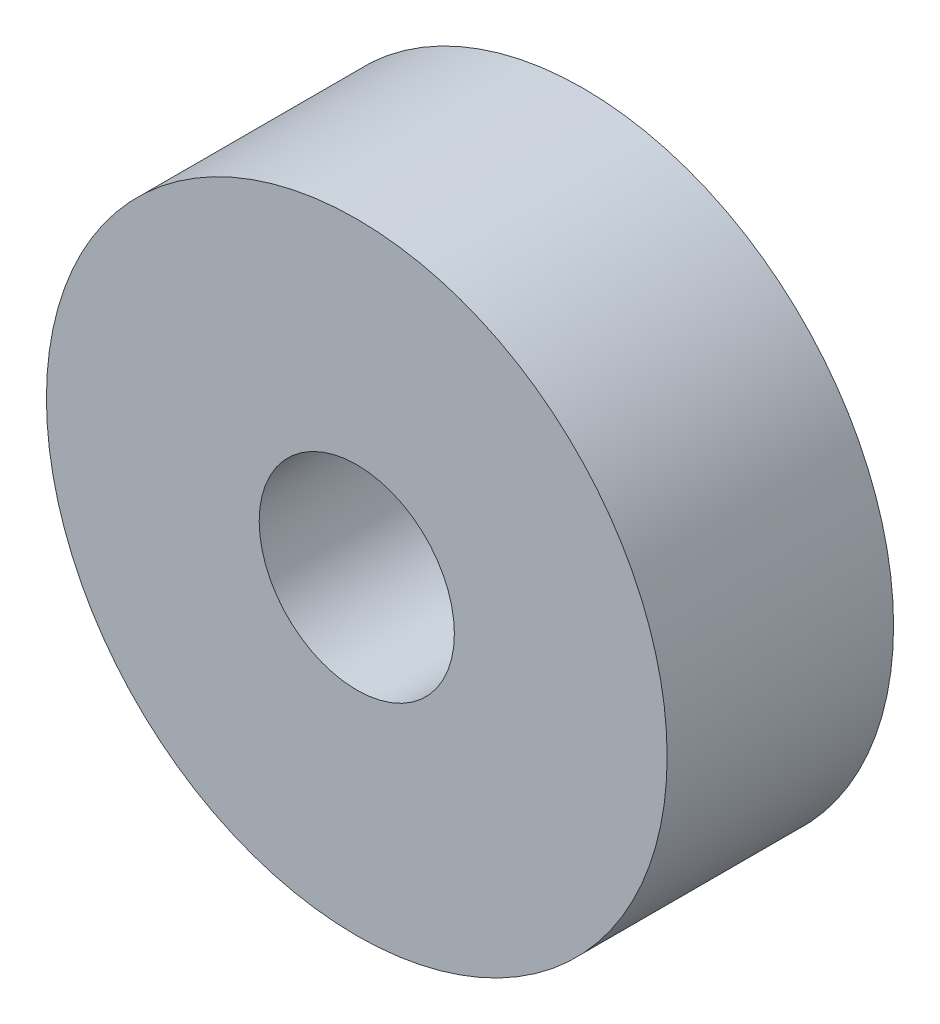
ISO-10303-21;
HEADER;
FILE_DESCRIPTION(('STEP AP214'),'2;1');
FILE_NAME('part.step','',(''),(''),'','','');
FILE_SCHEMA(('AUTOMOTIVE_DESIGN { 1 0 10303 214 1 1 1 1 }'));
ENDSEC;
DATA;
#1=APPLICATION_CONTEXT('core data for automotive mechanical design processes');
#2=APPLICATION_PROTOCOL_DEFINITION('international standard','automotive_design',2000,#1);
#3=PRODUCT_CONTEXT('',#1,'mechanical');
#4=PRODUCT('Part','Part','',(#3));
#5=PRODUCT_RELATED_PRODUCT_CATEGORY('part','',(#4));
#6=PRODUCT_DEFINITION_FORMATION('','',#4);
#7=PRODUCT_DEFINITION_CONTEXT('part definition',#1,'design');
#8=PRODUCT_DEFINITION('design','',#6,#7);
#9=PRODUCT_DEFINITION_SHAPE('','',#8);
#10=(LENGTH_UNIT() NAMED_UNIT(*) SI_UNIT(.MILLI.,.METRE.));
#11=(NAMED_UNIT(*) PLANE_ANGLE_UNIT() SI_UNIT($,.RADIAN.));
#12=(NAMED_UNIT(*) SI_UNIT($,.STERADIAN.) SOLID_ANGLE_UNIT());
#13=UNCERTAINTY_MEASURE_WITH_UNIT(LENGTH_MEASURE(1.E-05),#10,'distance_accuracy_value','');
#14=(GEOMETRIC_REPRESENTATION_CONTEXT(3) GLOBAL_UNCERTAINTY_ASSIGNED_CONTEXT((#13)) GLOBAL_UNIT_ASSIGNED_CONTEXT((#10,
#11,#12)) REPRESENTATION_CONTEXT('',''));
#15=CARTESIAN_POINT('',(0.,0.,0.));
#16=DIRECTION('',(0.,0.,1.));
#17=DIRECTION('',(1.,0.,0.));
#18=AXIS2_PLACEMENT_3D('',#15,#16,#17);
#19=CARTESIAN_POINT('',(0.,0.,0.));
#20=DIRECTION('',(0.,0.,1.));
#21=DIRECTION('',(-1.,0.,0.));
#22=AXIS2_PLACEMENT_3D('',#19,#20,#21);
#23=CYLINDRICAL_SURFACE('',#22,3.975);
#24=CARTESIAN_POINT('',(0.,0.,2.9));
#25=DIRECTION('',(0.,0.,1.));
#26=DIRECTION('',(-1.,0.,0.));
#27=AXIS2_PLACEMENT_3D('',#24,#25,#26);
#28=CIRCLE('',#27,3.975);
#29=CARTESIAN_POINT('',(-3.975,0.,2.9));
#30=VERTEX_POINT('',#29);
#31=EDGE_CURVE('E26',#30,#30,#28,.T.);
#32=ORIENTED_EDGE('',*,*,#31,.F.);
#33=EDGE_LOOP('',(#32));
#34=FACE_BOUND('',#33,.T.);
#35=CARTESIAN_POINT('',(0.,0.,0.));
#36=DIRECTION('',(0.,0.,1.));
#37=DIRECTION('',(-1.,0.,0.));
#38=AXIS2_PLACEMENT_3D('',#35,#36,#37);
#39=CIRCLE('',#38,3.975);
#40=CARTESIAN_POINT('',(-3.975,0.,0.));
#41=VERTEX_POINT('',#40);
#42=EDGE_CURVE('E19',#41,#41,#39,.T.);
#43=ORIENTED_EDGE('',*,*,#42,.T.);
#44=EDGE_LOOP('',(#43));
#45=FACE_BOUND('',#44,.T.);
#46=ADVANCED_FACE('F16',(#34,#45),#23,.T.);
#47=CARTESIAN_POINT('',(0.,0.,0.));
#48=DIRECTION('',(0.,0.,1.));
#49=DIRECTION('',(-1.,0.,0.));
#50=AXIS2_PLACEMENT_3D('',#47,#48,#49);
#51=CYLINDRICAL_SURFACE('',#50,1.25);
#52=CARTESIAN_POINT('',(0.,0.,2.9));
#53=DIRECTION('',(0.,0.,-1.));
#54=DIRECTION('',(-1.,0.,0.));
#55=AXIS2_PLACEMENT_3D('',#52,#53,#54);
#56=CIRCLE('',#55,1.25);
#57=CARTESIAN_POINT('',(-1.25,0.,2.9));
#58=VERTEX_POINT('',#57);
#59=EDGE_CURVE('E11',#58,#58,#56,.T.);
#60=ORIENTED_EDGE('',*,*,#59,.F.);
#61=EDGE_LOOP('',(#60));
#62=FACE_BOUND('',#61,.T.);
#63=CARTESIAN_POINT('',(0.,0.,0.));
#64=DIRECTION('',(0.,0.,1.));
#65=DIRECTION('',(-1.,0.,0.));
#66=AXIS2_PLACEMENT_3D('',#63,#64,#65);
#67=CIRCLE('',#66,1.25);
#68=CARTESIAN_POINT('',(-1.25,0.,0.));
#69=VERTEX_POINT('',#68);
#70=EDGE_CURVE('E46',#69,#69,#67,.T.);
#71=ORIENTED_EDGE('',*,*,#70,.F.);
#72=EDGE_LOOP('',(#71));
#73=FACE_BOUND('',#72,.T.);
#74=ADVANCED_FACE('F69',(#62,#73),#51,.F.);
#75=CARTESIAN_POINT('',(0.,0.,2.9));
#76=DIRECTION('',(0.,0.,1.));
#77=DIRECTION('',(1.,0.,0.));
#78=AXIS2_PLACEMENT_3D('',#75,#76,#77);
#79=PLANE('',#78);
#80=ORIENTED_EDGE('',*,*,#59,.T.);
#81=EDGE_LOOP('',(#80));
#82=FACE_BOUND('',#81,.T.);
#83=ORIENTED_EDGE('',*,*,#31,.T.);
#84=EDGE_LOOP('',(#83));
#85=FACE_BOUND('',#84,.T.);
#86=ADVANCED_FACE('F66',(#82,#85),#79,.T.);
#87=CARTESIAN_POINT('',(0.,0.,0.));
#88=DIRECTION('',(0.,0.,1.));
#89=DIRECTION('',(1.,0.,0.));
#90=AXIS2_PLACEMENT_3D('',#87,#88,#89);
#91=PLANE('',#90);
#92=ORIENTED_EDGE('',*,*,#70,.T.);
#93=EDGE_LOOP('',(#92));
#94=FACE_BOUND('',#93,.T.);
#95=ORIENTED_EDGE('',*,*,#42,.F.);
#96=EDGE_LOOP('',(#95));
#97=FACE_BOUND('',#96,.T.);
#98=ADVANCED_FACE('F79',(#94,#97),#91,.F.);
#99=CLOSED_SHELL('',(#46,#74,#86,#98));
#100=MANIFOLD_SOLID_BREP('B1',#99);
#101=ADVANCED_BREP_SHAPE_REPRESENTATION('',(#18,#100),#14);
#102=SHAPE_DEFINITION_REPRESENTATION(#9,#101);
ENDSEC;
END-ISO-10303-21;
